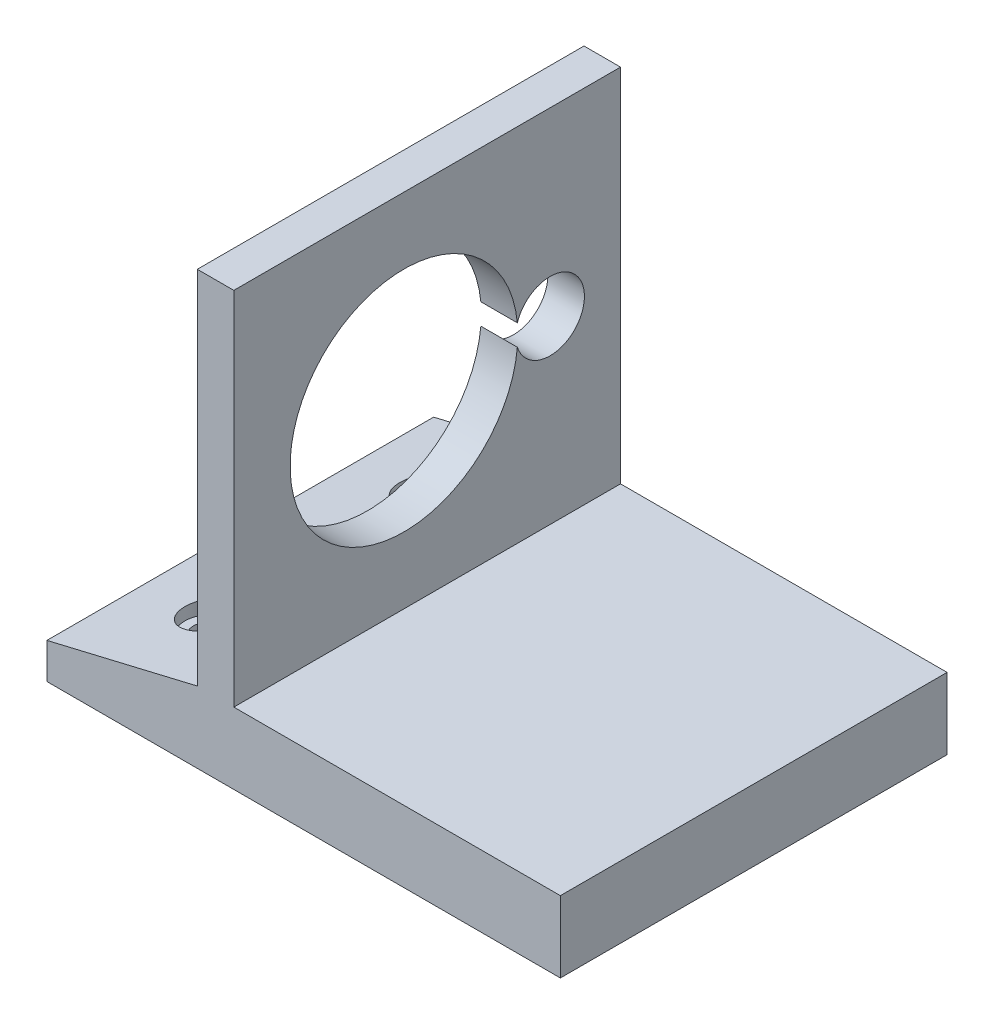
ISO-10303-21;
HEADER;
FILE_DESCRIPTION(('STEP AP214'),'2;1');
FILE_NAME('part.step','',(''),(''),'','','');
FILE_SCHEMA(('AUTOMOTIVE_DESIGN { 1 0 10303 214 1 1 1 1 }'));
ENDSEC;
DATA;
#1=APPLICATION_CONTEXT('core data for automotive mechanical design processes');
#2=APPLICATION_PROTOCOL_DEFINITION('international standard','automotive_design',2000,#1);
#3=PRODUCT_CONTEXT('',#1,'mechanical');
#4=PRODUCT('Part','Part','',(#3));
#5=PRODUCT_RELATED_PRODUCT_CATEGORY('part','',(#4));
#6=PRODUCT_DEFINITION_FORMATION('','',#4);
#7=PRODUCT_DEFINITION_CONTEXT('part definition',#1,'design');
#8=PRODUCT_DEFINITION('design','',#6,#7);
#9=PRODUCT_DEFINITION_SHAPE('','',#8);
#10=(LENGTH_UNIT() NAMED_UNIT(*) SI_UNIT(.MILLI.,.METRE.));
#11=(NAMED_UNIT(*) PLANE_ANGLE_UNIT() SI_UNIT($,.RADIAN.));
#12=(NAMED_UNIT(*) SI_UNIT($,.STERADIAN.) SOLID_ANGLE_UNIT());
#13=UNCERTAINTY_MEASURE_WITH_UNIT(LENGTH_MEASURE(1.E-05),#10,'distance_accuracy_value','');
#14=(GEOMETRIC_REPRESENTATION_CONTEXT(3) GLOBAL_UNCERTAINTY_ASSIGNED_CONTEXT((#13)) GLOBAL_UNIT_ASSIGNED_CONTEXT((#10,
#11,#12)) REPRESENTATION_CONTEXT('',''));
#15=CARTESIAN_POINT('',(0.,0.,0.));
#16=DIRECTION('',(0.,0.,1.));
#17=DIRECTION('',(1.,0.,0.));
#18=AXIS2_PLACEMENT_3D('',#15,#16,#17);
#19=CARTESIAN_POINT('',(-50.6835100710085,-554.760879723169,-10.));
#20=DIRECTION('',(0.,-1.,0.));
#21=DIRECTION('',(0.,0.,-1.));
#22=AXIS2_PLACEMENT_3D('',#19,#20,#21);
#23=CYLINDRICAL_SURFACE('',#22,2.);
#24=CARTESIAN_POINT('',(-50.6835100710085,-605.060879723169,-10.));
#25=DIRECTION('',(0.,-1.,0.));
#26=DIRECTION('',(0.,0.,-1.));
#27=AXIS2_PLACEMENT_3D('',#24,#25,#26);
#28=CIRCLE('',#27,2.);
#29=CARTESIAN_POINT('',(-50.6835100710085,-605.060879723169,-12.));
#30=VERTEX_POINT('',#29);
#31=EDGE_CURVE('E145',#30,#30,#28,.T.);
#32=ORIENTED_EDGE('',*,*,#31,.T.);
#33=EDGE_LOOP('',(#32));
#34=FACE_BOUND('',#33,.T.);
#35=CARTESIAN_POINT('',(-50.6835100710085,-600.910879723169,-10.));
#36=DIRECTION('',(0.,1.,0.));
#37=DIRECTION('',(0.,0.,1.));
#38=AXIS2_PLACEMENT_3D('',#35,#36,#37);
#39=CIRCLE('',#38,2.);
#40=CARTESIAN_POINT('',(-50.6835100710085,-600.910879723169,-8.00000000000004));
#41=VERTEX_POINT('',#40);
#42=EDGE_CURVE('E202',#41,#41,#39,.F.);
#43=ORIENTED_EDGE('',*,*,#42,.F.);
#44=EDGE_LOOP('',(#43));
#45=FACE_BOUND('',#44,.T.);
#46=ADVANCED_FACE('F39',(#34,#45),#23,.F.);
#47=CARTESIAN_POINT('',(-50.6835100710085,-554.760879723169,-35.));
#48=DIRECTION('',(0.,-1.,0.));
#49=DIRECTION('',(0.,0.,-1.));
#50=AXIS2_PLACEMENT_3D('',#47,#48,#49);
#51=CYLINDRICAL_SURFACE('',#50,2.);
#52=CARTESIAN_POINT('',(-50.6835100710085,-605.060879723169,-35.));
#53=DIRECTION('',(0.,-1.,0.));
#54=DIRECTION('',(0.,0.,-1.));
#55=AXIS2_PLACEMENT_3D('',#52,#53,#54);
#56=CIRCLE('',#55,2.);
#57=CARTESIAN_POINT('',(-50.6835100710085,-605.060879723169,-37.));
#58=VERTEX_POINT('',#57);
#59=EDGE_CURVE('E141',#58,#58,#56,.T.);
#60=ORIENTED_EDGE('',*,*,#59,.T.);
#61=EDGE_LOOP('',(#60));
#62=FACE_BOUND('',#61,.T.);
#63=CARTESIAN_POINT('',(-50.6835100710085,-600.910879723169,-35.));
#64=DIRECTION('',(0.,1.,0.));
#65=DIRECTION('',(0.,0.,1.));
#66=AXIS2_PLACEMENT_3D('',#63,#64,#65);
#67=CIRCLE('',#66,2.);
#68=CARTESIAN_POINT('',(-50.6835100710085,-600.910879723169,-33.));
#69=VERTEX_POINT('',#68);
#70=EDGE_CURVE('E138',#69,#69,#67,.F.);
#71=ORIENTED_EDGE('',*,*,#70,.F.);
#72=EDGE_LOOP('',(#71));
#73=FACE_BOUND('',#72,.T.);
#74=ADVANCED_FACE('F270',(#62,#73),#51,.F.);
#75=CARTESIAN_POINT('',(-42.2498204189982,-554.760879723169,-123.102700253565));
#76=DIRECTION('',(0.,1.,0.));
#77=DIRECTION('',(0.,0.,1.));
#78=AXIS2_PLACEMENT_3D('',#75,#76,#77);
#79=PLANE('',#78);
#80=DIRECTION('',(1.,0.,0.));
#81=VECTOR('',#80,1.);
#82=CARTESIAN_POINT('',(-42.2498204189982,-554.760879723169,-45.));
#83=LINE('',#82,#81);
#84=CARTESIAN_POINT('',(-42.2498204189982,-554.760879723169,-45.));
#85=VERTEX_POINT('',#84);
#86=CARTESIAN_POINT('',(-38.,-554.760879723169,-45.));
#87=VERTEX_POINT('',#86);
#88=EDGE_CURVE('E48',#85,#87,#83,.T.);
#89=ORIENTED_EDGE('',*,*,#88,.F.);
#90=DIRECTION('',(0.,0.,1.));
#91=VECTOR('',#90,1.);
#92=CARTESIAN_POINT('',(-42.2498204189982,-554.760879723169,-123.102700253565));
#93=LINE('',#92,#91);
#94=CARTESIAN_POINT('',(-42.2498204189982,-554.760879723169,0.));
#95=VERTEX_POINT('',#94);
#96=EDGE_CURVE('E185',#85,#95,#93,.T.);
#97=ORIENTED_EDGE('',*,*,#96,.T.);
#98=DIRECTION('',(-1.,0.,0.));
#99=VECTOR('',#98,1.);
#100=CARTESIAN_POINT('',(-42.2498204189982,-554.760879723169,0.));
#101=LINE('',#100,#99);
#102=CARTESIAN_POINT('',(-38.,-554.760879723169,0.));
#103=VERTEX_POINT('',#102);
#104=EDGE_CURVE('E144',#103,#95,#101,.T.);
#105=ORIENTED_EDGE('',*,*,#104,.F.);
#106=DIRECTION('',(0.,0.,1.));
#107=VECTOR('',#106,1.);
#108=CARTESIAN_POINT('',(-38.,-554.760879723169,-123.102700253565));
#109=LINE('',#108,#107);
#110=EDGE_CURVE('E151',#87,#103,#109,.T.);
#111=ORIENTED_EDGE('',*,*,#110,.F.);
#112=EDGE_LOOP('',(#89,#97,#105,#111));
#113=FACE_BOUND('',#112,.T.);
#114=ADVANCED_FACE('F41',(#113),#79,.T.);
#115=CARTESIAN_POINT('',(-38.,-554.760879723169,-123.102700253565));
#116=DIRECTION('',(1.,0.,0.));
#117=DIRECTION('',(0.,0.,-1.));
#118=AXIS2_PLACEMENT_3D('',#115,#116,#117);
#119=PLANE('',#118);
#120=CARTESIAN_POINT('',(-38.,-575.76087972317,-19.7999999528378));
#121=DIRECTION('',(1.,0.,0.));
#122=DIRECTION('',(0.,0.,-1.));
#123=AXIS2_PLACEMENT_3D('',#120,#121,#122);
#124=CIRCLE('',#123,13.25);
#125=CARTESIAN_POINT('',(-38.,-574.533336366829,-32.9930146692816));
#126=VERTEX_POINT('',#125);
#127=CARTESIAN_POINT('',(-38.,-576.98842307951,-32.9930146692817));
#128=VERTEX_POINT('',#127);
#129=EDGE_CURVE('E117',#126,#128,#124,.T.);
#130=ORIENTED_EDGE('',*,*,#129,.F.);
#131=CARTESIAN_POINT('',(-38.,-575.760879723169,-36.8000000000001));
#132=DIRECTION('',(1.,0.,0.));
#133=DIRECTION('',(0.,0.,-1.));
#134=AXIS2_PLACEMENT_3D('',#131,#132,#133);
#135=CIRCLE('',#134,4.00000000000003);
#136=EDGE_CURVE('E119',#128,#126,#135,.T.);
#137=ORIENTED_EDGE('',*,*,#136,.F.);
#138=EDGE_LOOP('',(#130,#137));
#139=FACE_BOUND('',#138,.T.);
#140=DIRECTION('',(0.,-1.,0.));
#141=VECTOR('',#140,1.);
#142=CARTESIAN_POINT('',(-38.,-554.760879723169,-45.));
#143=LINE('',#142,#141);
#144=CARTESIAN_POINT('',(-38.,-596.760879723169,-45.));
#145=VERTEX_POINT('',#144);
#146=EDGE_CURVE('E159',#87,#145,#143,.T.);
#147=ORIENTED_EDGE('',*,*,#146,.F.);
#148=ORIENTED_EDGE('',*,*,#110,.T.);
#149=DIRECTION('',(0.,1.,0.));
#150=VECTOR('',#149,1.);
#151=CARTESIAN_POINT('',(-38.,-554.760879723169,0.));
#152=LINE('',#151,#150);
#153=CARTESIAN_POINT('',(-38.,-596.760879723169,0.));
#154=VERTEX_POINT('',#153);
#155=EDGE_CURVE('E182',#154,#103,#152,.T.);
#156=ORIENTED_EDGE('',*,*,#155,.F.);
#157=DIRECTION('',(0.,0.,1.));
#158=VECTOR('',#157,1.);
#159=CARTESIAN_POINT('',(-38.,-596.760879723169,-123.102700253565));
#160=LINE('',#159,#158);
#161=EDGE_CURVE('E187',#145,#154,#160,.T.);
#162=ORIENTED_EDGE('',*,*,#161,.F.);
#163=EDGE_LOOP('',(#147,#148,#156,#162));
#164=FACE_BOUND('',#163,.T.);
#165=ADVANCED_FACE('F243',(#139,#164),#119,.T.);
#166=CARTESIAN_POINT('',(-38.,-596.760879723169,-123.102700253565));
#167=DIRECTION('',(0.,1.,0.));
#168=DIRECTION('',(0.,0.,1.));
#169=AXIS2_PLACEMENT_3D('',#166,#167,#168);
#170=PLANE('',#169);
#171=DIRECTION('',(1.,0.,0.));
#172=VECTOR('',#171,1.);
#173=CARTESIAN_POINT('',(-38.,-596.760879723169,-45.));
#174=LINE('',#173,#172);
#175=CARTESIAN_POINT('',(0.,-596.760879723169,-45.));
#176=VERTEX_POINT('',#175);
#177=EDGE_CURVE('E157',#145,#176,#174,.T.);
#178=ORIENTED_EDGE('',*,*,#177,.F.);
#179=ORIENTED_EDGE('',*,*,#161,.T.);
#180=DIRECTION('',(-1.,0.,0.));
#181=VECTOR('',#180,1.);
#182=CARTESIAN_POINT('',(-38.,-596.760879723169,0.));
#183=LINE('',#182,#181);
#184=CARTESIAN_POINT('',(0.,-596.760879723169,0.));
#185=VERTEX_POINT('',#184);
#186=EDGE_CURVE('E179',#185,#154,#183,.T.);
#187=ORIENTED_EDGE('',*,*,#186,.F.);
#188=DIRECTION('',(0.,0.,1.));
#189=VECTOR('',#188,1.);
#190=CARTESIAN_POINT('',(0.,-596.760879723169,-123.102700253565));
#191=LINE('',#190,#189);
#192=EDGE_CURVE('E189',#176,#185,#191,.T.);
#193=ORIENTED_EDGE('',*,*,#192,.F.);
#194=EDGE_LOOP('',(#178,#179,#187,#193));
#195=FACE_BOUND('',#194,.T.);
#196=ADVANCED_FACE('F249',(#195),#170,.T.);
#197=CARTESIAN_POINT('',(0.,-596.760879723169,-123.102700253565));
#198=DIRECTION('',(1.,0.,0.));
#199=DIRECTION('',(0.,1.,0.));
#200=AXIS2_PLACEMENT_3D('',#197,#198,#199);
#201=PLANE('',#200);
#202=DIRECTION('',(0.,-1.,0.));
#203=VECTOR('',#202,1.);
#204=CARTESIAN_POINT('',(0.,-596.760879723169,-45.));
#205=LINE('',#204,#203);
#206=CARTESIAN_POINT('',(0.,-605.060879723169,-45.));
#207=VERTEX_POINT('',#206);
#208=EDGE_CURVE('E155',#176,#207,#205,.T.);
#209=ORIENTED_EDGE('',*,*,#208,.F.);
#210=ORIENTED_EDGE('',*,*,#192,.T.);
#211=DIRECTION('',(0.,1.,0.));
#212=VECTOR('',#211,1.);
#213=CARTESIAN_POINT('',(0.,-596.760879723169,0.));
#214=LINE('',#213,#212);
#215=CARTESIAN_POINT('',(0.,-605.060879723169,0.));
#216=VERTEX_POINT('',#215);
#217=EDGE_CURVE('E176',#216,#185,#214,.T.);
#218=ORIENTED_EDGE('',*,*,#217,.F.);
#219=DIRECTION('',(0.,0.,1.));
#220=VECTOR('',#219,1.);
#221=CARTESIAN_POINT('',(0.,-605.060879723169,-123.102700253565));
#222=LINE('',#221,#220);
#223=EDGE_CURVE('E191',#207,#216,#222,.T.);
#224=ORIENTED_EDGE('',*,*,#223,.F.);
#225=EDGE_LOOP('',(#209,#210,#218,#224));
#226=FACE_BOUND('',#225,.T.);
#227=ADVANCED_FACE('F253',(#226),#201,.T.);
#228=CARTESIAN_POINT('',(0.,-605.060879723169,-123.102700253565));
#229=DIRECTION('',(0.,-1.,0.));
#230=DIRECTION('',(0.,0.,-1.));
#231=AXIS2_PLACEMENT_3D('',#228,#229,#230);
#232=PLANE('',#231);
#233=ORIENTED_EDGE('',*,*,#59,.F.);
#234=EDGE_LOOP('',(#233));
#235=FACE_BOUND('',#234,.T.);
#236=ORIENTED_EDGE('',*,*,#31,.F.);
#237=EDGE_LOOP('',(#236));
#238=FACE_BOUND('',#237,.T.);
#239=DIRECTION('',(-1.,0.,0.));
#240=VECTOR('',#239,1.);
#241=CARTESIAN_POINT('',(0.,-605.060879723169,-45.));
#242=LINE('',#241,#240);
#243=CARTESIAN_POINT('',(-59.7489898399811,-605.060879723169,-45.));
#244=VERTEX_POINT('',#243);
#245=EDGE_CURVE('E153',#207,#244,#242,.T.);
#246=ORIENTED_EDGE('',*,*,#245,.F.);
#247=ORIENTED_EDGE('',*,*,#223,.T.);
#248=DIRECTION('',(1.,0.,0.));
#249=VECTOR('',#248,1.);
#250=CARTESIAN_POINT('',(0.,-605.060879723169,0.));
#251=LINE('',#250,#249);
#252=CARTESIAN_POINT('',(-59.7489898399811,-605.060879723169,0.));
#253=VERTEX_POINT('',#252);
#254=EDGE_CURVE('E173',#253,#216,#251,.T.);
#255=ORIENTED_EDGE('',*,*,#254,.F.);
#256=DIRECTION('',(0.,0.,1.));
#257=VECTOR('',#256,1.);
#258=CARTESIAN_POINT('',(-59.7489898399811,-605.060879723169,-123.102700253565));
#259=LINE('',#258,#257);
#260=EDGE_CURVE('E193',#244,#253,#259,.T.);
#261=ORIENTED_EDGE('',*,*,#260,.F.);
#262=EDGE_LOOP('',(#246,#247,#255,#261));
#263=FACE_BOUND('',#262,.T.);
#264=ADVANCED_FACE('F257',(#235,#238,#263),#232,.T.);
#265=CARTESIAN_POINT('',(-59.7489898399811,-605.060879723169,-123.102700253565));
#266=DIRECTION('',(-1.,0.,0.));
#267=DIRECTION('',(0.,0.,1.));
#268=AXIS2_PLACEMENT_3D('',#265,#266,#267);
#269=PLANE('',#268);
#270=DIRECTION('',(0.,1.,0.));
#271=VECTOR('',#270,1.);
#272=CARTESIAN_POINT('',(-59.7489898399811,-605.060879723169,-45.));
#273=LINE('',#272,#271);
#274=CARTESIAN_POINT('',(-59.7489898399811,-600.910879723169,-45.));
#275=VERTEX_POINT('',#274);
#276=EDGE_CURVE('E150',#244,#275,#273,.T.);
#277=ORIENTED_EDGE('',*,*,#276,.F.);
#278=ORIENTED_EDGE('',*,*,#260,.T.);
#279=DIRECTION('',(0.,-1.,0.));
#280=VECTOR('',#279,1.);
#281=CARTESIAN_POINT('',(-59.7489898399811,-605.060879723169,0.));
#282=LINE('',#281,#280);
#283=CARTESIAN_POINT('',(-59.7489898399811,-600.910879723169,0.));
#284=VERTEX_POINT('',#283);
#285=EDGE_CURVE('E170',#284,#253,#282,.T.);
#286=ORIENTED_EDGE('',*,*,#285,.F.);
#287=DIRECTION('',(0.,0.,1.));
#288=VECTOR('',#287,1.);
#289=CARTESIAN_POINT('',(-59.7489898399811,-600.910879723169,-123.102700253565));
#290=LINE('',#289,#288);
#291=EDGE_CURVE('E195',#275,#284,#290,.T.);
#292=ORIENTED_EDGE('',*,*,#291,.F.);
#293=EDGE_LOOP('',(#277,#278,#286,#292));
#294=FACE_BOUND('',#293,.T.);
#295=ADVANCED_FACE('F217',(#294),#269,.T.);
#296=CARTESIAN_POINT('',(-59.7489898399811,-600.910879723169,-123.102700253565));
#297=DIRECTION('',(-0.230753836059882,0.973012161868314,0.));
#298=DIRECTION('',(-0.973012161868314,-0.230753836059882,0.));
#299=AXIS2_PLACEMENT_3D('',#296,#297,#298);
#300=PLANE('',#299);
#301=CARTESIAN_POINT('',(-50.6835100710085,-598.760963910815,-35.));
#302=DIRECTION('',(-0.230753836059882,0.973012161868314,0.));
#303=DIRECTION('',(0.973012161868314,0.230753836059882,0.));
#304=AXIS2_PLACEMENT_3D('',#301,#302,#303);
#305=ELLIPSE('',#304,3.08320914945153,3.);
#306=CARTESIAN_POINT('',(-47.6835100710085,-598.049501572204,-35.));
#307=VERTEX_POINT('',#306);
#308=EDGE_CURVE('E43',#307,#307,#305,.T.);
#309=ORIENTED_EDGE('',*,*,#308,.F.);
#310=EDGE_LOOP('',(#309));
#311=FACE_BOUND('',#310,.T.);
#312=CARTESIAN_POINT('',(-50.6835100710085,-598.760963910815,-10.));
#313=DIRECTION('',(-0.230753836059882,0.973012161868314,0.));
#314=DIRECTION('',(0.973012161868314,0.230753836059882,0.));
#315=AXIS2_PLACEMENT_3D('',#312,#313,#314);
#316=ELLIPSE('',#315,3.08320914945153,3.);
#317=CARTESIAN_POINT('',(-47.6835100710085,-598.049501572204,-10.));
#318=VERTEX_POINT('',#317);
#319=EDGE_CURVE('E204',#318,#318,#316,.T.);
#320=ORIENTED_EDGE('',*,*,#319,.F.);
#321=EDGE_LOOP('',(#320));
#322=FACE_BOUND('',#321,.T.);
#323=DIRECTION('',(0.973012161868314,0.230753836059882,0.));
#324=VECTOR('',#323,1.);
#325=CARTESIAN_POINT('',(-59.7489898399811,-600.910879723169,-45.));
#326=LINE('',#325,#324);
#327=CARTESIAN_POINT('',(-42.2498204189982,-596.760879723169,-45.));
#328=VERTEX_POINT('',#327);
#329=EDGE_CURVE('E148',#275,#328,#326,.T.);
#330=ORIENTED_EDGE('',*,*,#329,.F.);
#331=ORIENTED_EDGE('',*,*,#291,.T.);
#332=DIRECTION('',(-0.973012161868314,-0.230753836059882,0.));
#333=VECTOR('',#332,1.);
#334=CARTESIAN_POINT('',(-59.7489898399811,-600.910879723169,0.));
#335=LINE('',#334,#333);
#336=CARTESIAN_POINT('',(-42.2498204189982,-596.760879723169,0.));
#337=VERTEX_POINT('',#336);
#338=EDGE_CURVE('E167',#337,#284,#335,.T.);
#339=ORIENTED_EDGE('',*,*,#338,.F.);
#340=DIRECTION('',(0.,0.,1.));
#341=VECTOR('',#340,1.);
#342=CARTESIAN_POINT('',(-42.2498204189982,-596.760879723169,-123.102700253565));
#343=LINE('',#342,#341);
#344=EDGE_CURVE('E197',#328,#337,#343,.T.);
#345=ORIENTED_EDGE('',*,*,#344,.F.);
#346=EDGE_LOOP('',(#330,#331,#339,#345));
#347=FACE_BOUND('',#346,.T.);
#348=ADVANCED_FACE('F214',(#311,#322,#347),#300,.T.);
#349=CARTESIAN_POINT('',(-42.2498204189982,-596.760879723169,-123.102700253565));
#350=DIRECTION('',(-1.,0.,0.));
#351=DIRECTION('',(0.,0.,1.));
#352=AXIS2_PLACEMENT_3D('',#349,#350,#351);
#353=PLANE('',#352);
#354=CARTESIAN_POINT('',(-42.2498204189982,-575.76087972317,-19.7999999528378));
#355=DIRECTION('',(-1.,0.,0.));
#356=DIRECTION('',(0.,0.,1.));
#357=AXIS2_PLACEMENT_3D('',#354,#355,#356);
#358=CIRCLE('',#357,13.25);
#359=CARTESIAN_POINT('',(-42.2498204189982,-576.98842307951,-32.9930146692817));
#360=VERTEX_POINT('',#359);
#361=CARTESIAN_POINT('',(-42.2498204189982,-574.533336366829,-32.9930146692816));
#362=VERTEX_POINT('',#361);
#363=EDGE_CURVE('E63',#360,#362,#358,.T.);
#364=ORIENTED_EDGE('',*,*,#363,.F.);
#365=CARTESIAN_POINT('',(-42.2498204189982,-575.760879723169,-36.8000000000001));
#366=DIRECTION('',(-1.,0.,0.));
#367=DIRECTION('',(0.,0.,1.));
#368=AXIS2_PLACEMENT_3D('',#365,#366,#367);
#369=CIRCLE('',#368,4.00000000000003);
#370=EDGE_CURVE('E123',#362,#360,#369,.T.);
#371=ORIENTED_EDGE('',*,*,#370,.F.);
#372=EDGE_LOOP('',(#364,#371));
#373=FACE_BOUND('',#372,.T.);
#374=DIRECTION('',(0.,1.,0.));
#375=VECTOR('',#374,1.);
#376=CARTESIAN_POINT('',(-42.2498204189982,-596.760879723169,-45.));
#377=LINE('',#376,#375);
#378=EDGE_CURVE('E11',#328,#85,#377,.T.);
#379=ORIENTED_EDGE('',*,*,#378,.F.);
#380=ORIENTED_EDGE('',*,*,#344,.T.);
#381=DIRECTION('',(0.,-1.,0.));
#382=VECTOR('',#381,1.);
#383=CARTESIAN_POINT('',(-42.2498204189982,-596.760879723169,0.));
#384=LINE('',#383,#382);
#385=EDGE_CURVE('E164',#95,#337,#384,.T.);
#386=ORIENTED_EDGE('',*,*,#385,.F.);
#387=ORIENTED_EDGE('',*,*,#96,.F.);
#388=EDGE_LOOP('',(#379,#380,#386,#387));
#389=FACE_BOUND('',#388,.T.);
#390=ADVANCED_FACE('F127',(#373,#389),#353,.T.);
#391=CARTESIAN_POINT('',(0.,0.,0.));
#392=DIRECTION('',(0.,0.,-1.));
#393=DIRECTION('',(-1.,0.,0.));
#394=AXIS2_PLACEMENT_3D('',#391,#392,#393);
#395=PLANE('',#394);
#396=ORIENTED_EDGE('',*,*,#104,.T.);
#397=ORIENTED_EDGE('',*,*,#385,.T.);
#398=ORIENTED_EDGE('',*,*,#338,.T.);
#399=ORIENTED_EDGE('',*,*,#285,.T.);
#400=ORIENTED_EDGE('',*,*,#254,.T.);
#401=ORIENTED_EDGE('',*,*,#217,.T.);
#402=ORIENTED_EDGE('',*,*,#186,.T.);
#403=ORIENTED_EDGE('',*,*,#155,.T.);
#404=EDGE_LOOP('',(#396,#397,#398,#399,#400,#401,#402,#403));
#405=FACE_BOUND('',#404,.T.);
#406=ADVANCED_FACE('F232',(#405),#395,.F.);
#407=CARTESIAN_POINT('',(0.,-135.651012106187,-45.));
#408=DIRECTION('',(0.,0.,1.));
#409=DIRECTION('',(1.,0.,0.));
#410=AXIS2_PLACEMENT_3D('',#407,#408,#409);
#411=PLANE('',#410);
#412=ORIENTED_EDGE('',*,*,#88,.T.);
#413=ORIENTED_EDGE('',*,*,#146,.T.);
#414=ORIENTED_EDGE('',*,*,#177,.T.);
#415=ORIENTED_EDGE('',*,*,#208,.T.);
#416=ORIENTED_EDGE('',*,*,#245,.T.);
#417=ORIENTED_EDGE('',*,*,#276,.T.);
#418=ORIENTED_EDGE('',*,*,#329,.T.);
#419=ORIENTED_EDGE('',*,*,#378,.T.);
#420=EDGE_LOOP('',(#412,#413,#414,#415,#416,#417,#418,#419));
#421=FACE_BOUND('',#420,.T.);
#422=ADVANCED_FACE('F237',(#421),#411,.F.);
#423=CARTESIAN_POINT('',(-50.6835100710085,-600.910879723169,-35.));
#424=DIRECTION('',(0.,1.,0.));
#425=DIRECTION('',(0.,0.,1.));
#426=AXIS2_PLACEMENT_3D('',#423,#424,#425);
#427=PLANE('',#426);
#428=CARTESIAN_POINT('',(-50.6835100710085,-600.910879723169,-35.));
#429=DIRECTION('',(0.,1.,0.));
#430=DIRECTION('',(0.,0.,1.));
#431=AXIS2_PLACEMENT_3D('',#428,#429,#430);
#432=CIRCLE('',#431,3.);
#433=CARTESIAN_POINT('',(-50.6835100710085,-600.910879723169,-32.));
#434=VERTEX_POINT('',#433);
#435=EDGE_CURVE('E135',#434,#434,#432,.T.);
#436=ORIENTED_EDGE('',*,*,#435,.T.);
#437=EDGE_LOOP('',(#436));
#438=FACE_BOUND('',#437,.T.);
#439=ORIENTED_EDGE('',*,*,#70,.T.);
#440=EDGE_LOOP('',(#439));
#441=FACE_BOUND('',#440,.T.);
#442=ADVANCED_FACE('F283',(#438,#441),#427,.T.);
#443=CARTESIAN_POINT('',(-50.6835100710085,-600.910879723169,-35.));
#444=DIRECTION('',(0.,1.,0.));
#445=DIRECTION('',(0.,0.,1.));
#446=AXIS2_PLACEMENT_3D('',#443,#444,#445);
#447=CYLINDRICAL_SURFACE('',#446,3.);
#448=ORIENTED_EDGE('',*,*,#308,.T.);
#449=EDGE_LOOP('',(#448));
#450=FACE_BOUND('',#449,.T.);
#451=ORIENTED_EDGE('',*,*,#435,.F.);
#452=EDGE_LOOP('',(#451));
#453=FACE_BOUND('',#452,.T.);
#454=ADVANCED_FACE('F211',(#450,#453),#447,.F.);
#455=CARTESIAN_POINT('',(-50.6835100710085,-600.910879723169,-10.));
#456=DIRECTION('',(0.,1.,0.));
#457=DIRECTION('',(0.,0.,1.));
#458=AXIS2_PLACEMENT_3D('',#455,#456,#457);
#459=PLANE('',#458);
#460=CARTESIAN_POINT('',(-50.6835100710085,-600.910879723169,-10.));
#461=DIRECTION('',(0.,1.,0.));
#462=DIRECTION('',(0.,0.,1.));
#463=AXIS2_PLACEMENT_3D('',#460,#461,#462);
#464=CIRCLE('',#463,3.);
#465=CARTESIAN_POINT('',(-50.6835100710085,-600.910879723169,-7.00000000000004));
#466=VERTEX_POINT('',#465);
#467=EDGE_CURVE('E134',#466,#466,#464,.T.);
#468=ORIENTED_EDGE('',*,*,#467,.T.);
#469=EDGE_LOOP('',(#468));
#470=FACE_BOUND('',#469,.T.);
#471=ORIENTED_EDGE('',*,*,#42,.T.);
#472=EDGE_LOOP('',(#471));
#473=FACE_BOUND('',#472,.T.);
#474=ADVANCED_FACE('F358',(#470,#473),#459,.T.);
#475=CARTESIAN_POINT('',(-50.6835100710085,-600.910879723169,-10.));
#476=DIRECTION('',(0.,1.,0.));
#477=DIRECTION('',(0.,0.,1.));
#478=AXIS2_PLACEMENT_3D('',#475,#476,#477);
#479=CYLINDRICAL_SURFACE('',#478,3.);
#480=ORIENTED_EDGE('',*,*,#319,.T.);
#481=EDGE_LOOP('',(#480));
#482=FACE_BOUND('',#481,.T.);
#483=ORIENTED_EDGE('',*,*,#467,.F.);
#484=EDGE_LOOP('',(#483));
#485=FACE_BOUND('',#484,.T.);
#486=ADVANCED_FACE('F367',(#482,#485),#479,.F.);
#487=CARTESIAN_POINT('',(0.,-575.76087972317,-19.7999999528378));
#488=DIRECTION('',(-1.,0.,0.));
#489=DIRECTION('',(0.,0.,1.));
#490=AXIS2_PLACEMENT_3D('',#487,#488,#489);
#491=CYLINDRICAL_SURFACE('',#490,13.25);
#492=ORIENTED_EDGE('',*,*,#129,.T.);
#493=DIRECTION('',(-1.,0.,0.));
#494=VECTOR('',#493,1.);
#495=CARTESIAN_POINT('',(0.,-576.98842307951,-32.9930146692817));
#496=LINE('',#495,#494);
#497=EDGE_CURVE('E56',#128,#360,#496,.T.);
#498=ORIENTED_EDGE('',*,*,#497,.T.);
#499=ORIENTED_EDGE('',*,*,#363,.T.);
#500=DIRECTION('',(-1.,0.,0.));
#501=VECTOR('',#500,1.);
#502=CARTESIAN_POINT('',(0.,-574.533336366829,-32.9930146692816));
#503=LINE('',#502,#501);
#504=EDGE_CURVE('E120',#126,#362,#503,.T.);
#505=ORIENTED_EDGE('',*,*,#504,.F.);
#506=EDGE_LOOP('',(#492,#498,#499,#505));
#507=FACE_BOUND('',#506,.T.);
#508=ADVANCED_FACE('F115',(#507),#491,.F.);
#509=CARTESIAN_POINT('',(0.,-575.760879723169,-36.8000000000001));
#510=DIRECTION('',(-1.,0.,0.));
#511=DIRECTION('',(0.,0.,1.));
#512=AXIS2_PLACEMENT_3D('',#509,#510,#511);
#513=CYLINDRICAL_SURFACE('',#512,4.00000000000003);
#514=ORIENTED_EDGE('',*,*,#136,.T.);
#515=ORIENTED_EDGE('',*,*,#504,.T.);
#516=ORIENTED_EDGE('',*,*,#370,.T.);
#517=ORIENTED_EDGE('',*,*,#497,.F.);
#518=EDGE_LOOP('',(#514,#515,#516,#517));
#519=FACE_BOUND('',#518,.T.);
#520=ADVANCED_FACE('F124',(#519),#513,.F.);
#521=CLOSED_SHELL('',(#46,#74,#114,#165,#196,#227,#264,#295,#348,#390,#406,#422,#442,#454,#474,
#486,#508,#520));
#522=MANIFOLD_SOLID_BREP('B2',#521);
#523=ADVANCED_BREP_SHAPE_REPRESENTATION('',(#18,#522),#14);
#524=SHAPE_DEFINITION_REPRESENTATION(#9,#523);
ENDSEC;
END-ISO-10303-21;
